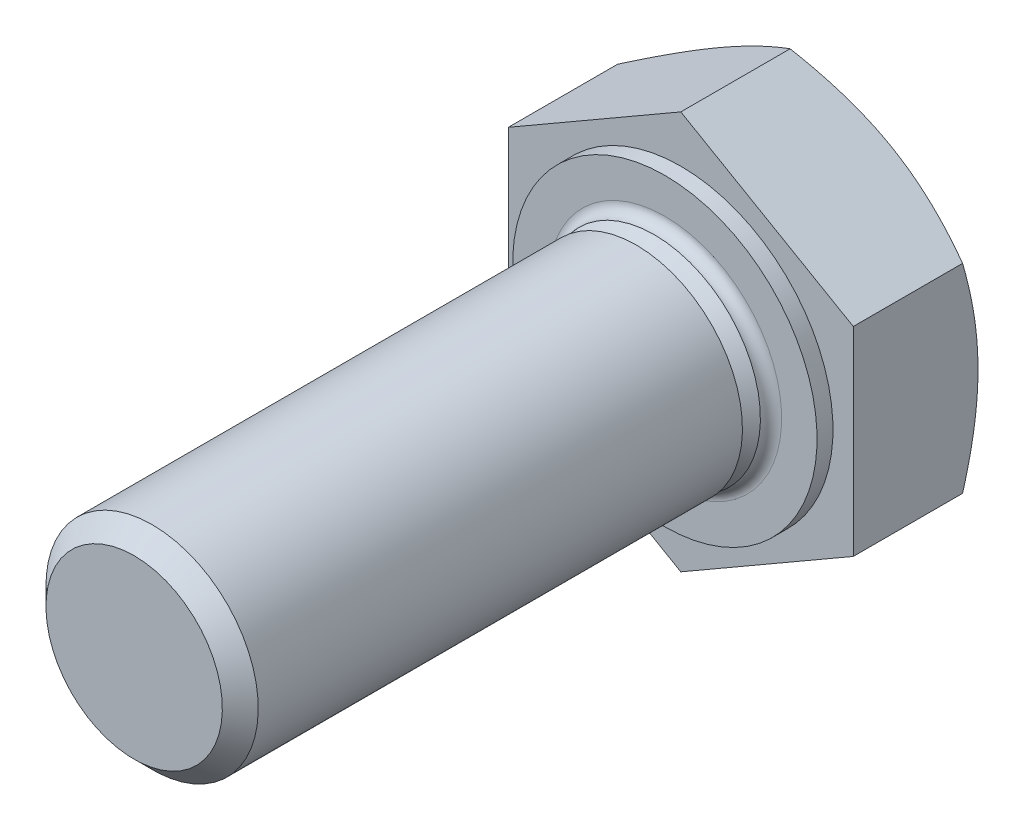
ISO-10303-21;
HEADER;
FILE_DESCRIPTION(('STEP AP214'),'2;1');
FILE_NAME('part.step','',(''),(''),'','','');
FILE_SCHEMA(('AUTOMOTIVE_DESIGN { 1 0 10303 214 1 1 1 1 }'));
ENDSEC;
DATA;
#1=APPLICATION_CONTEXT('core data for automotive mechanical design processes');
#2=APPLICATION_PROTOCOL_DEFINITION('international standard','automotive_design',2000,#1);
#3=PRODUCT_CONTEXT('',#1,'mechanical');
#4=PRODUCT('Part','Part','',(#3));
#5=PRODUCT_RELATED_PRODUCT_CATEGORY('part','',(#4));
#6=PRODUCT_DEFINITION_FORMATION('','',#4);
#7=PRODUCT_DEFINITION_CONTEXT('part definition',#1,'design');
#8=PRODUCT_DEFINITION('design','',#6,#7);
#9=PRODUCT_DEFINITION_SHAPE('','',#8);
#10=(LENGTH_UNIT() NAMED_UNIT(*) SI_UNIT(.MILLI.,.METRE.));
#11=(NAMED_UNIT(*) PLANE_ANGLE_UNIT() SI_UNIT($,.RADIAN.));
#12=(NAMED_UNIT(*) SI_UNIT($,.STERADIAN.) SOLID_ANGLE_UNIT());
#13=UNCERTAINTY_MEASURE_WITH_UNIT(LENGTH_MEASURE(1.E-05),#10,'distance_accuracy_value','');
#14=(GEOMETRIC_REPRESENTATION_CONTEXT(3) GLOBAL_UNCERTAINTY_ASSIGNED_CONTEXT((#13)) GLOBAL_UNIT_ASSIGNED_CONTEXT((#10,
#11,#12)) REPRESENTATION_CONTEXT('',''));
#15=CARTESIAN_POINT('',(0.,0.,0.));
#16=DIRECTION('',(0.,0.,1.));
#17=DIRECTION('',(1.,0.,0.));
#18=AXIS2_PLACEMENT_3D('',#15,#16,#17);
#19=CARTESIAN_POINT('',(0.,1.66171875,20.));
#20=DIRECTION('',(0.,0.,1.));
#21=DIRECTION('',(0.,1.,0.));
#22=AXIS2_PLACEMENT_3D('',#19,#20,#21);
#23=PLANE('',#22);
#24=CARTESIAN_POINT('',(0.,0.,20.));
#25=DIRECTION('',(0.,0.,1.));
#26=DIRECTION('',(0.,1.,0.));
#27=AXIS2_PLACEMENT_3D('',#24,#25,#26);
#28=CIRCLE('',#27,3.3234375);
#29=CARTESIAN_POINT('',(0.,3.3234375,20.));
#30=VERTEX_POINT('',#29);
#31=EDGE_CURVE('E11',#30,#30,#28,.T.);
#32=ORIENTED_EDGE('',*,*,#31,.T.);
#33=EDGE_LOOP('',(#32));
#34=FACE_BOUND('',#33,.T.);
#35=ADVANCED_FACE('F17',(#34),#23,.T.);
#36=CARTESIAN_POINT('',(0.,0.,19.66171875));
#37=DIRECTION('',(0.,0.,-1.));
#38=DIRECTION('',(0.,1.,0.));
#39=AXIS2_PLACEMENT_3D('',#36,#37,#38);
#40=CONICAL_SURFACE('',#39,3.66171875,0.785398163397449);
#41=CARTESIAN_POINT('',(0.,0.,19.3234375));
#42=DIRECTION('',(0.,0.,1.));
#43=DIRECTION('',(0.,1.,0.));
#44=AXIS2_PLACEMENT_3D('',#41,#42,#43);
#45=CIRCLE('',#44,4.);
#46=CARTESIAN_POINT('',(0.,4.,19.3234375));
#47=VERTEX_POINT('',#46);
#48=EDGE_CURVE('E26',#47,#47,#45,.T.);
#49=ORIENTED_EDGE('',*,*,#48,.T.);
#50=EDGE_LOOP('',(#49));
#51=FACE_BOUND('',#50,.T.);
#52=ORIENTED_EDGE('',*,*,#31,.F.);
#53=EDGE_LOOP('',(#52));
#54=FACE_BOUND('',#53,.T.);
#55=ADVANCED_FACE('F310',(#51,#54),#40,.T.);
#56=CARTESIAN_POINT('',(0.,0.,10.2));
#57=DIRECTION('',(0.,0.,-1.));
#58=DIRECTION('',(0.,1.,0.));
#59=AXIS2_PLACEMENT_3D('',#56,#57,#58);
#60=CYLINDRICAL_SURFACE('',#59,4.);
#61=CARTESIAN_POINT('',(0.,0.,1.0765625));
#62=DIRECTION('',(0.,0.,1.));
#63=DIRECTION('',(0.,1.,0.));
#64=AXIS2_PLACEMENT_3D('',#61,#62,#63);
#65=CIRCLE('',#64,4.);
#66=CARTESIAN_POINT('',(0.,4.,1.0765625));
#67=VERTEX_POINT('',#66);
#68=EDGE_CURVE('E49',#67,#67,#65,.T.);
#69=ORIENTED_EDGE('',*,*,#68,.T.);
#70=EDGE_LOOP('',(#69));
#71=FACE_BOUND('',#70,.T.);
#72=ORIENTED_EDGE('',*,*,#48,.F.);
#73=EDGE_LOOP('',(#72));
#74=FACE_BOUND('',#73,.T.);
#75=ADVANCED_FACE('F315',(#71,#74),#60,.T.);
#76=CARTESIAN_POINT('',(0.,3.66171875,1.0765625));
#77=DIRECTION('',(0.,0.,-1.));
#78=DIRECTION('',(0.,-1.,0.));
#79=AXIS2_PLACEMENT_3D('',#76,#77,#78);
#80=PLANE('',#79);
#81=CARTESIAN_POINT('',(0.,0.,1.0765625));
#82=DIRECTION('',(0.,0.,1.));
#83=DIRECTION('',(0.,1.,0.));
#84=AXIS2_PLACEMENT_3D('',#81,#82,#83);
#85=CIRCLE('',#84,3.3234375);
#86=CARTESIAN_POINT('',(0.,3.3234375,1.0765625));
#87=VERTEX_POINT('',#86);
#88=EDGE_CURVE('E55',#87,#87,#85,.T.);
#89=ORIENTED_EDGE('',*,*,#88,.T.);
#90=EDGE_LOOP('',(#89));
#91=FACE_BOUND('',#90,.T.);
#92=ORIENTED_EDGE('',*,*,#68,.F.);
#93=EDGE_LOOP('',(#92));
#94=FACE_BOUND('',#93,.T.);
#95=ADVANCED_FACE('F347',(#91,#94),#80,.T.);
#96=CARTESIAN_POINT('',(0.,0.,0.73828125));
#97=DIRECTION('',(0.,0.,-1.));
#98=DIRECTION('',(0.,1.,0.));
#99=AXIS2_PLACEMENT_3D('',#96,#97,#98);
#100=CONICAL_SURFACE('',#99,3.66171875,0.785398163397448);
#101=CARTESIAN_POINT('',(0.,0.,0.4));
#102=DIRECTION('',(0.,0.,1.));
#103=DIRECTION('',(0.,1.,0.));
#104=AXIS2_PLACEMENT_3D('',#101,#102,#103);
#105=CIRCLE('',#104,4.);
#106=CARTESIAN_POINT('',(0.,4.,0.4));
#107=VERTEX_POINT('',#106);
#108=EDGE_CURVE('E219',#107,#107,#105,.T.);
#109=ORIENTED_EDGE('',*,*,#108,.T.);
#110=EDGE_LOOP('',(#109));
#111=FACE_BOUND('',#110,.T.);
#112=ORIENTED_EDGE('',*,*,#88,.F.);
#113=EDGE_LOOP('',(#112));
#114=FACE_BOUND('',#113,.T.);
#115=ADVANCED_FACE('F341',(#111,#114),#100,.T.);
#116=CARTESIAN_POINT('',(0.,0.,0.4));
#117=DIRECTION('',(0.,0.,1.));
#118=DIRECTION('',(1.,0.,0.));
#119=AXIS2_PLACEMENT_3D('',#116,#117,#118);
#120=TOROIDAL_SURFACE('',#119,4.4,0.4);
#121=CARTESIAN_POINT('',(0.,0.,0.));
#122=DIRECTION('',(0.,0.,1.));
#123=DIRECTION('',(0.,1.,0.));
#124=AXIS2_PLACEMENT_3D('',#121,#122,#123);
#125=CIRCLE('',#124,4.4);
#126=CARTESIAN_POINT('',(0.,4.4,0.));
#127=VERTEX_POINT('',#126);
#128=EDGE_CURVE('E207',#127,#127,#125,.T.);
#129=ORIENTED_EDGE('',*,*,#128,.T.);
#130=EDGE_LOOP('',(#129));
#131=FACE_BOUND('',#130,.T.);
#132=ORIENTED_EDGE('',*,*,#108,.F.);
#133=EDGE_LOOP('',(#132));
#134=FACE_BOUND('',#133,.T.);
#135=ADVANCED_FACE('F338',(#131,#134),#120,.F.);
#136=CARTESIAN_POINT('',(0.,5.0675,0.));
#137=DIRECTION('',(0.,0.,1.));
#138=DIRECTION('',(0.,1.,0.));
#139=AXIS2_PLACEMENT_3D('',#136,#137,#138);
#140=PLANE('',#139);
#141=CARTESIAN_POINT('',(0.,0.,0.));
#142=DIRECTION('',(0.,0.,1.));
#143=DIRECTION('',(0.,1.,0.));
#144=AXIS2_PLACEMENT_3D('',#141,#142,#143);
#145=CIRCLE('',#144,5.735);
#146=CARTESIAN_POINT('',(0.,5.735,0.));
#147=VERTEX_POINT('',#146);
#148=EDGE_CURVE('E111',#147,#147,#145,.T.);
#149=ORIENTED_EDGE('',*,*,#148,.T.);
#150=EDGE_LOOP('',(#149));
#151=FACE_BOUND('',#150,.T.);
#152=ORIENTED_EDGE('',*,*,#128,.F.);
#153=EDGE_LOOP('',(#152));
#154=FACE_BOUND('',#153,.T.);
#155=ADVANCED_FACE('F333',(#151,#154),#140,.T.);
#156=CARTESIAN_POINT('',(0.,0.,-0.55));
#157=DIRECTION('',(0.,0.,-1.));
#158=DIRECTION('',(0.,1.,0.));
#159=AXIS2_PLACEMENT_3D('',#156,#157,#158);
#160=CYLINDRICAL_SURFACE('',#159,5.735);
#161=ORIENTED_EDGE('',*,*,#148,.F.);
#162=EDGE_LOOP('',(#161));
#163=FACE_BOUND('',#162,.T.);
#164=CARTESIAN_POINT('',(0.,0.,-0.6));
#165=DIRECTION('',(0.,0.,1.));
#166=DIRECTION('',(0.,1.,0.));
#167=AXIS2_PLACEMENT_3D('',#164,#165,#166);
#168=CIRCLE('',#167,5.735);
#169=CARTESIAN_POINT('',(0.,-5.735,-0.6));
#170=VERTEX_POINT('',#169);
#171=EDGE_CURVE('E253',#170,#170,#168,.T.);
#172=ORIENTED_EDGE('',*,*,#171,.T.);
#173=EDGE_LOOP('',(#172));
#174=FACE_BOUND('',#173,.T.);
#175=ADVANCED_FACE('F328',(#163,#174),#160,.T.);
#176=CARTESIAN_POINT('',(-3.25,-5.62916512459885,0.4));
#177=DIRECTION('',(-0.5,-0.866025403784439,0.));
#178=DIRECTION('',(-0.866025403784439,0.5,0.));
#179=AXIS2_PLACEMENT_3D('',#176,#177,#178);
#180=PLANE('',#179);
#181=CARTESIAN_POINT('',(0.0033701276522522,-7.50749924357236,-4.71831960379145));
#182=CARTESIAN_POINT('',(-1.74031548600823,-6.50078188514341,-5.3));
#183=CARTESIAN_POINT('',(-3.25,-5.62916512459885,-5.3));
#184=CARTESIAN_POINT('',(-4.75968451399176,-4.75754836405429,-5.3));
#185=CARTESIAN_POINT('',(-6.50337012765225,-3.75083100562533,-4.71831960379145));
#186=(BOUNDED_CURVE() B_SPLINE_CURVE(2,(#181,#182,#183,#184,#185),.UNSPECIFIED.,.F.,
.F.) B_SPLINE_CURVE_WITH_KNOTS((3,2,3),(0.,3.81115565838423,7.62231131676846),
.UNSPECIFIED.) CURVE() GEOMETRIC_REPRESENTATION_ITEM() RATIONAL_B_SPLINE_CURVE((1.,
1.03802697460133,1.,1.03802697460134,1.)) REPRESENTATION_ITEM(''));
#187=CARTESIAN_POINT('',(0.,-7.50555349946513,-4.71944341639924));
#188=VERTEX_POINT('',#187);
#189=CARTESIAN_POINT('',(-3.25,-5.62916512459885,-5.3));
#190=VERTEX_POINT('',#189);
#191=EDGE_CURVE('E115',#188,#190,#186,.T.);
#192=ORIENTED_EDGE('',*,*,#191,.F.);
#193=DIRECTION('',(0.,0.,-1.));
#194=VECTOR('',#193,1.);
#195=CARTESIAN_POINT('',(0.,-7.50555349946513,0.4));
#196=LINE('',#195,#194);
#197=CARTESIAN_POINT('',(0.,-7.50555349946513,-0.6));
#198=VERTEX_POINT('',#197);
#199=EDGE_CURVE('E97',#198,#188,#196,.T.);
#200=ORIENTED_EDGE('',*,*,#199,.F.);
#201=DIRECTION('',(0.866025403784439,-0.5,0.));
#202=VECTOR('',#201,1.);
#203=CARTESIAN_POINT('',(-2.43728928513604,-6.09838387459885,-0.6));
#204=LINE('',#203,#202);
#205=CARTESIAN_POINT('',(-6.5,-3.75277674973257,-0.6));
#206=VERTEX_POINT('',#205);
#207=EDGE_CURVE('E256',#206,#198,#204,.T.);
#208=ORIENTED_EDGE('',*,*,#207,.F.);
#209=DIRECTION('',(0.,0.,-1.));
#210=VECTOR('',#209,1.);
#211=CARTESIAN_POINT('',(-6.5,-3.75277674973257,0.4));
#212=LINE('',#211,#210);
#213=CARTESIAN_POINT('',(-6.5,-3.75277674973256,-4.71944341639924));
#214=VERTEX_POINT('',#213);
#215=EDGE_CURVE('E231',#206,#214,#212,.T.);
#216=ORIENTED_EDGE('',*,*,#215,.T.);
#217=CARTESIAN_POINT('',(0.0033701276522522,-7.50749924357236,-4.71831960379145));
#218=CARTESIAN_POINT('',(-1.74031548600823,-6.50078188514341,-5.3));
#219=CARTESIAN_POINT('',(-3.25,-5.62916512459885,-5.3));
#220=CARTESIAN_POINT('',(-4.75968451399176,-4.75754836405429,-5.3));
#221=CARTESIAN_POINT('',(-6.50337012765225,-3.75083100562533,-4.71831960379145));
#222=(BOUNDED_CURVE() B_SPLINE_CURVE(2,(#217,#218,#219,#220,#221),.UNSPECIFIED.,.F.,
.F.) B_SPLINE_CURVE_WITH_KNOTS((3,2,3),(0.,3.81115565838423,7.62231131676846),
.UNSPECIFIED.) CURVE() GEOMETRIC_REPRESENTATION_ITEM() RATIONAL_B_SPLINE_CURVE((1.,
1.03802697460133,1.,1.03802697460134,1.)) REPRESENTATION_ITEM(''));
#223=EDGE_CURVE('E118',#190,#214,#222,.T.);
#224=ORIENTED_EDGE('',*,*,#223,.F.);
#225=EDGE_LOOP('',(#192,#200,#208,#216,#224));
#226=FACE_BOUND('',#225,.T.);
#227=ADVANCED_FACE('F116',(#226),#180,.T.);
#228=CARTESIAN_POINT('',(6.5,0.,0.4));
#229=DIRECTION('',(1.,0.,0.));
#230=DIRECTION('',(0.,-1.,0.));
#231=AXIS2_PLACEMENT_3D('',#228,#229,#230);
#232=PLANE('',#231);
#233=CARTESIAN_POINT('',(6.5,3.75666823794703,-4.71831960379145));
#234=CARTESIAN_POINT('',(6.5,1.74323352108911,-5.3));
#235=CARTESIAN_POINT('',(6.5,0.,-5.3));
#236=CARTESIAN_POINT('',(6.5,-1.74323352108911,-5.3));
#237=CARTESIAN_POINT('',(6.5,-3.75666823794702,-4.71831960379145));
#238=(BOUNDED_CURVE() B_SPLINE_CURVE(2,(#233,#234,#235,#236,#237),.UNSPECIFIED.,.F.,
.F.) B_SPLINE_CURVE_WITH_KNOTS((3,2,3),(0.,3.81115565838423,7.62231131676846),
.UNSPECIFIED.) CURVE() GEOMETRIC_REPRESENTATION_ITEM() RATIONAL_B_SPLINE_CURVE((1.,
1.03802697460134,1.,1.03802697460135,1.)) REPRESENTATION_ITEM(''));
#239=CARTESIAN_POINT('',(6.5,3.75277674973257,-4.71944341639923));
#240=VERTEX_POINT('',#239);
#241=CARTESIAN_POINT('',(6.5,0.,-5.3));
#242=VERTEX_POINT('',#241);
#243=EDGE_CURVE('E197',#240,#242,#238,.T.);
#244=ORIENTED_EDGE('',*,*,#243,.F.);
#245=DIRECTION('',(0.,0.,-1.));
#246=VECTOR('',#245,1.);
#247=CARTESIAN_POINT('',(6.5,3.75277674973257,0.4));
#248=LINE('',#247,#246);
#249=CARTESIAN_POINT('',(6.5,3.75277674973257,-0.6));
#250=VERTEX_POINT('',#249);
#251=EDGE_CURVE('E229',#250,#240,#248,.T.);
#252=ORIENTED_EDGE('',*,*,#251,.F.);
#253=DIRECTION('',(0.,1.,0.));
#254=VECTOR('',#253,1.);
#255=CARTESIAN_POINT('',(6.5,-1.876875,-0.6));
#256=LINE('',#255,#254);
#257=CARTESIAN_POINT('',(6.5,-3.75277674973256,-0.6));
#258=VERTEX_POINT('',#257);
#259=EDGE_CURVE('E167',#258,#250,#256,.T.);
#260=ORIENTED_EDGE('',*,*,#259,.F.);
#261=DIRECTION('',(0.,0.,-1.));
#262=VECTOR('',#261,1.);
#263=CARTESIAN_POINT('',(6.5,-3.75277674973256,0.4));
#264=LINE('',#263,#262);
#265=CARTESIAN_POINT('',(6.5,-3.75277674973256,-4.71944341639923));
#266=VERTEX_POINT('',#265);
#267=EDGE_CURVE('E112',#258,#266,#264,.T.);
#268=ORIENTED_EDGE('',*,*,#267,.T.);
#269=CARTESIAN_POINT('',(6.5,3.75666823794703,-4.71831960379145));
#270=CARTESIAN_POINT('',(6.5,1.74323352108911,-5.3));
#271=CARTESIAN_POINT('',(6.5,0.,-5.3));
#272=CARTESIAN_POINT('',(6.5,-1.74323352108911,-5.3));
#273=CARTESIAN_POINT('',(6.5,-3.75666823794702,-4.71831960379145));
#274=(BOUNDED_CURVE() B_SPLINE_CURVE(2,(#269,#270,#271,#272,#273),.UNSPECIFIED.,.F.,
.F.) B_SPLINE_CURVE_WITH_KNOTS((3,2,3),(0.,3.81115565838423,7.62231131676846),
.UNSPECIFIED.) CURVE() GEOMETRIC_REPRESENTATION_ITEM() RATIONAL_B_SPLINE_CURVE((1.,
1.03802697460134,1.,1.03802697460135,1.)) REPRESENTATION_ITEM(''));
#275=EDGE_CURVE('E166',#242,#266,#274,.T.);
#276=ORIENTED_EDGE('',*,*,#275,.F.);
#277=EDGE_LOOP('',(#244,#252,#260,#268,#276));
#278=FACE_BOUND('',#277,.T.);
#279=ADVANCED_FACE('F285',(#278),#232,.T.);
#280=CARTESIAN_POINT('',(3.25,-5.62916512459885,0.4));
#281=DIRECTION('',(0.5,-0.866025403784439,0.));
#282=DIRECTION('',(-0.866025403784439,-0.5,0.));
#283=AXIS2_PLACEMENT_3D('',#280,#281,#282);
#284=PLANE('',#283);
#285=CARTESIAN_POINT('',(6.50337012765225,-3.75083100562534,-4.71831960379145));
#286=CARTESIAN_POINT('',(4.75968451399176,-4.7575483640543,-5.3));
#287=CARTESIAN_POINT('',(3.25,-5.62916512459885,-5.3));
#288=CARTESIAN_POINT('',(1.74031548600824,-6.5007818851434,-5.3));
#289=CARTESIAN_POINT('',(-0.00337012765224415,-7.50749924357236,-4.71831960379145));
#290=(BOUNDED_CURVE() B_SPLINE_CURVE(2,(#285,#286,#287,#288,#289),.UNSPECIFIED.,.F.,
.F.) B_SPLINE_CURVE_WITH_KNOTS((3,2,3),(0.,3.81115565838422,7.62231131676845),
.UNSPECIFIED.) CURVE() GEOMETRIC_REPRESENTATION_ITEM() RATIONAL_B_SPLINE_CURVE((1.,
1.03802697460134,1.,1.03802697460134,1.)) REPRESENTATION_ITEM(''));
#291=CARTESIAN_POINT('',(3.25,-5.62916512459885,-5.3));
#292=VERTEX_POINT('',#291);
#293=EDGE_CURVE('E126',#266,#292,#290,.T.);
#294=ORIENTED_EDGE('',*,*,#293,.F.);
#295=ORIENTED_EDGE('',*,*,#267,.F.);
#296=DIRECTION('',(0.866025403784439,0.5,0.));
#297=VECTOR('',#296,1.);
#298=CARTESIAN_POINT('',(2.43728928513604,-6.09838387459885,-0.6));
#299=LINE('',#298,#297);
#300=EDGE_CURVE('E107',#198,#258,#299,.T.);
#301=ORIENTED_EDGE('',*,*,#300,.F.);
#302=ORIENTED_EDGE('',*,*,#199,.T.);
#303=CARTESIAN_POINT('',(6.50337012765225,-3.75083100562534,-4.71831960379145));
#304=CARTESIAN_POINT('',(4.75968451399176,-4.7575483640543,-5.3));
#305=CARTESIAN_POINT('',(3.25,-5.62916512459885,-5.3));
#306=CARTESIAN_POINT('',(1.74031548600824,-6.5007818851434,-5.3));
#307=CARTESIAN_POINT('',(-0.00337012765224415,-7.50749924357236,-4.71831960379145));
#308=(BOUNDED_CURVE() B_SPLINE_CURVE(2,(#303,#304,#305,#306,#307),.UNSPECIFIED.,.F.,
.F.) B_SPLINE_CURVE_WITH_KNOTS((3,2,3),(0.,3.81115565838422,7.62231131676845),
.UNSPECIFIED.) CURVE() GEOMETRIC_REPRESENTATION_ITEM() RATIONAL_B_SPLINE_CURVE((1.,
1.03802697460134,1.,1.03802697460134,1.)) REPRESENTATION_ITEM(''));
#309=EDGE_CURVE('E102',#292,#188,#308,.T.);
#310=ORIENTED_EDGE('',*,*,#309,.F.);
#311=EDGE_LOOP('',(#294,#295,#301,#302,#310));
#312=FACE_BOUND('',#311,.T.);
#313=ADVANCED_FACE('F100',(#312),#284,.T.);
#314=CARTESIAN_POINT('',(-6.5,0.,0.4));
#315=DIRECTION('',(-1.,0.,0.));
#316=DIRECTION('',(0.,1.,0.));
#317=AXIS2_PLACEMENT_3D('',#314,#315,#316);
#318=PLANE('',#317);
#319=CARTESIAN_POINT('',(-6.5,-3.75666823794702,-4.71831960379145));
#320=CARTESIAN_POINT('',(-6.5,-1.74323352108911,-5.3));
#321=CARTESIAN_POINT('',(-6.5,0.,-5.3));
#322=CARTESIAN_POINT('',(-6.5,1.74323352108911,-5.3));
#323=CARTESIAN_POINT('',(-6.5,3.75666823794702,-4.71831960379145));
#324=(BOUNDED_CURVE() B_SPLINE_CURVE(2,(#319,#320,#321,#322,#323),.UNSPECIFIED.,.F.,
.F.) B_SPLINE_CURVE_WITH_KNOTS((3,2,3),(0.,3.81115565838423,7.62231131676846),
.UNSPECIFIED.) CURVE() GEOMETRIC_REPRESENTATION_ITEM() RATIONAL_B_SPLINE_CURVE((1.,
1.03802697460133,1.,1.03802697460133,1.)) REPRESENTATION_ITEM(''));
#325=CARTESIAN_POINT('',(-6.5,0.,-5.3));
#326=VERTEX_POINT('',#325);
#327=CARTESIAN_POINT('',(-6.5,3.75277674973256,-4.71944341639924));
#328=VERTEX_POINT('',#327);
#329=EDGE_CURVE('E150',#326,#328,#324,.T.);
#330=ORIENTED_EDGE('',*,*,#329,.F.);
#331=CARTESIAN_POINT('',(-6.5,-3.75666823794702,-4.71831960379145));
#332=CARTESIAN_POINT('',(-6.5,-1.74323352108911,-5.3));
#333=CARTESIAN_POINT('',(-6.5,0.,-5.3));
#334=CARTESIAN_POINT('',(-6.5,1.74323352108911,-5.3));
#335=CARTESIAN_POINT('',(-6.5,3.75666823794702,-4.71831960379145));
#336=(BOUNDED_CURVE() B_SPLINE_CURVE(2,(#331,#332,#333,#334,#335),.UNSPECIFIED.,.F.,
.F.) B_SPLINE_CURVE_WITH_KNOTS((3,2,3),(0.,3.81115565838423,7.62231131676846),
.UNSPECIFIED.) CURVE() GEOMETRIC_REPRESENTATION_ITEM() RATIONAL_B_SPLINE_CURVE((1.,
1.03802697460133,1.,1.03802697460133,1.)) REPRESENTATION_ITEM(''));
#337=EDGE_CURVE('E178',#214,#326,#336,.T.);
#338=ORIENTED_EDGE('',*,*,#337,.F.);
#339=ORIENTED_EDGE('',*,*,#215,.F.);
#340=DIRECTION('',(0.,-1.,0.));
#341=VECTOR('',#340,1.);
#342=CARTESIAN_POINT('',(-6.5,-1.876875,-0.6));
#343=LINE('',#342,#341);
#344=CARTESIAN_POINT('',(-6.5,3.75277674973256,-0.6));
#345=VERTEX_POINT('',#344);
#346=EDGE_CURVE('E226',#345,#206,#343,.T.);
#347=ORIENTED_EDGE('',*,*,#346,.F.);
#348=DIRECTION('',(0.,0.,-1.));
#349=VECTOR('',#348,1.);
#350=CARTESIAN_POINT('',(-6.5,3.75277674973256,0.4));
#351=LINE('',#350,#349);
#352=EDGE_CURVE('E177',#345,#328,#351,.T.);
#353=ORIENTED_EDGE('',*,*,#352,.T.);
#354=EDGE_LOOP('',(#330,#338,#339,#347,#353));
#355=FACE_BOUND('',#354,.T.);
#356=ADVANCED_FACE('F273',(#355),#318,.T.);
#357=CARTESIAN_POINT('',(3.25,5.62916512459885,0.4));
#358=DIRECTION('',(0.5,0.866025403784439,0.));
#359=DIRECTION('',(0.866025403784439,-0.5,0.));
#360=AXIS2_PLACEMENT_3D('',#357,#358,#359);
#361=PLANE('',#360);
#362=CARTESIAN_POINT('',(-0.00337012765224939,7.50749924357236,-4.71831960379145));
#363=CARTESIAN_POINT('',(1.74031548600824,6.50078188514341,-5.3));
#364=CARTESIAN_POINT('',(3.25,5.62916512459885,-5.3));
#365=CARTESIAN_POINT('',(4.75968451399176,4.75754836405431,-5.30000000000001));
#366=CARTESIAN_POINT('',(6.50337012765225,3.75083100562534,-4.71831960379145));
#367=(BOUNDED_CURVE() B_SPLINE_CURVE(2,(#362,#363,#364,#365,#366),.UNSPECIFIED.,.F.,
.F.) B_SPLINE_CURVE_WITH_KNOTS((3,2,3),(0.,3.81115565838423,7.62231131676845),
.UNSPECIFIED.) CURVE() GEOMETRIC_REPRESENTATION_ITEM() RATIONAL_B_SPLINE_CURVE((1.,
1.03802697460132,1.,1.03802697460133,1.)) REPRESENTATION_ITEM(''));
#368=CARTESIAN_POINT('',(3.25,5.62916512459885,-5.3));
#369=VERTEX_POINT('',#368);
#370=EDGE_CURVE('E182',#369,#240,#367,.T.);
#371=ORIENTED_EDGE('',*,*,#370,.F.);
#372=CARTESIAN_POINT('',(-0.00337012765224939,7.50749924357236,-4.71831960379145));
#373=CARTESIAN_POINT('',(1.74031548600824,6.50078188514341,-5.3));
#374=CARTESIAN_POINT('',(3.25,5.62916512459885,-5.3));
#375=CARTESIAN_POINT('',(4.75968451399176,4.75754836405431,-5.30000000000001));
#376=CARTESIAN_POINT('',(6.50337012765225,3.75083100562534,-4.71831960379145));
#377=(BOUNDED_CURVE() B_SPLINE_CURVE(2,(#372,#373,#374,#375,#376),.UNSPECIFIED.,.F.,
.F.) B_SPLINE_CURVE_WITH_KNOTS((3,2,3),(0.,3.81115565838423,7.62231131676845),
.UNSPECIFIED.) CURVE() GEOMETRIC_REPRESENTATION_ITEM() RATIONAL_B_SPLINE_CURVE((1.,
1.03802697460132,1.,1.03802697460133,1.)) REPRESENTATION_ITEM(''));
#378=CARTESIAN_POINT('',(0.,7.50555349946513,-4.71944341639923));
#379=VERTEX_POINT('',#378);
#380=EDGE_CURVE('E141',#379,#369,#377,.T.);
#381=ORIENTED_EDGE('',*,*,#380,.F.);
#382=DIRECTION('',(0.,0.,-1.));
#383=VECTOR('',#382,1.);
#384=CARTESIAN_POINT('',(0.,7.50555349946513,0.4));
#385=LINE('',#384,#383);
#386=CARTESIAN_POINT('',(0.,7.50555349946513,-0.6));
#387=VERTEX_POINT('',#386);
#388=EDGE_CURVE('E227',#387,#379,#385,.T.);
#389=ORIENTED_EDGE('',*,*,#388,.F.);
#390=DIRECTION('',(-0.866025403784439,0.5,0.));
#391=VECTOR('',#390,1.);
#392=CARTESIAN_POINT('',(4.06271071486396,5.15994637459885,-0.6));
#393=LINE('',#392,#391);
#394=EDGE_CURVE('E173',#250,#387,#393,.T.);
#395=ORIENTED_EDGE('',*,*,#394,.F.);
#396=ORIENTED_EDGE('',*,*,#251,.T.);
#397=EDGE_LOOP('',(#371,#381,#389,#395,#396));
#398=FACE_BOUND('',#397,.T.);
#399=ADVANCED_FACE('F288',(#398),#361,.T.);
#400=CARTESIAN_POINT('',(-3.25,5.62916512459885,0.4));
#401=DIRECTION('',(-0.5,0.866025403784439,0.));
#402=DIRECTION('',(0.866025403784439,0.5,0.));
#403=AXIS2_PLACEMENT_3D('',#400,#401,#402);
#404=PLANE('',#403);
#405=CARTESIAN_POINT('',(-6.50337012765225,3.75083100562533,-4.71831960379145));
#406=CARTESIAN_POINT('',(-4.75968451399177,4.7575483640543,-5.30000000000001));
#407=CARTESIAN_POINT('',(-3.25,5.62916512459885,-5.3));
#408=CARTESIAN_POINT('',(-1.74031548600823,6.5007818851434,-5.29999999999999));
#409=CARTESIAN_POINT('',(0.00337012765224554,7.50749924357236,-4.71831960379145));
#410=(BOUNDED_CURVE() B_SPLINE_CURVE(2,(#405,#406,#407,#408,#409),.UNSPECIFIED.,.F.,
.F.) B_SPLINE_CURVE_WITH_KNOTS((3,2,3),(0.,3.81115565838423,7.62231131676846),
.UNSPECIFIED.) CURVE() GEOMETRIC_REPRESENTATION_ITEM() RATIONAL_B_SPLINE_CURVE((1.,
1.03802697460133,1.,1.03802697460132,1.)) REPRESENTATION_ITEM(''));
#411=CARTESIAN_POINT('',(-3.25,5.62916512459885,-5.3));
#412=VERTEX_POINT('',#411);
#413=EDGE_CURVE('E222',#412,#379,#410,.T.);
#414=ORIENTED_EDGE('',*,*,#413,.F.);
#415=CARTESIAN_POINT('',(-6.50337012765225,3.75083100562533,-4.71831960379145));
#416=CARTESIAN_POINT('',(-4.75968451399177,4.7575483640543,-5.30000000000001));
#417=CARTESIAN_POINT('',(-3.25,5.62916512459885,-5.3));
#418=CARTESIAN_POINT('',(-1.74031548600823,6.5007818851434,-5.29999999999999));
#419=CARTESIAN_POINT('',(0.00337012765224554,7.50749924357236,-4.71831960379145));
#420=(BOUNDED_CURVE() B_SPLINE_CURVE(2,(#415,#416,#417,#418,#419),.UNSPECIFIED.,.F.,
.F.) B_SPLINE_CURVE_WITH_KNOTS((3,2,3),(0.,3.81115565838423,7.62231131676846),
.UNSPECIFIED.) CURVE() GEOMETRIC_REPRESENTATION_ITEM() RATIONAL_B_SPLINE_CURVE((1.,
1.03802697460133,1.,1.03802697460132,1.)) REPRESENTATION_ITEM(''));
#421=EDGE_CURVE('E131',#328,#412,#420,.T.);
#422=ORIENTED_EDGE('',*,*,#421,.F.);
#423=ORIENTED_EDGE('',*,*,#352,.F.);
#424=DIRECTION('',(-0.866025403784439,-0.5,0.));
#425=VECTOR('',#424,1.);
#426=CARTESIAN_POINT('',(-4.06271071486396,5.15994637459885,-0.6));
#427=LINE('',#426,#425);
#428=EDGE_CURVE('E223',#387,#345,#427,.T.);
#429=ORIENTED_EDGE('',*,*,#428,.F.);
#430=ORIENTED_EDGE('',*,*,#388,.T.);
#431=EDGE_LOOP('',(#414,#422,#423,#429,#430));
#432=FACE_BOUND('',#431,.T.);
#433=ADVANCED_FACE('F291',(#432),#404,.T.);
#434=CARTESIAN_POINT('',(0.,-3.25,-5.3));
#435=DIRECTION('',(0.,0.,-1.));
#436=DIRECTION('',(0.,-1.,0.));
#437=AXIS2_PLACEMENT_3D('',#434,#435,#436);
#438=PLANE('',#437);
#439=CARTESIAN_POINT('',(0.,0.,-5.3));
#440=DIRECTION('',(0.,0.,-1.));
#441=DIRECTION('',(0.,-1.,0.));
#442=AXIS2_PLACEMENT_3D('',#439,#440,#441);
#443=CIRCLE('',#442,6.5);
#444=EDGE_CURVE('E121',#292,#190,#443,.T.);
#445=ORIENTED_EDGE('',*,*,#444,.T.);
#446=CARTESIAN_POINT('',(0.,0.,-5.3));
#447=DIRECTION('',(0.,0.,-1.));
#448=DIRECTION('',(0.,-1.,0.));
#449=AXIS2_PLACEMENT_3D('',#446,#447,#448);
#450=CIRCLE('',#449,6.5);
#451=EDGE_CURVE('E174',#190,#326,#450,.T.);
#452=ORIENTED_EDGE('',*,*,#451,.T.);
#453=CARTESIAN_POINT('',(0.,0.,-5.3));
#454=DIRECTION('',(0.,0.,-1.));
#455=DIRECTION('',(0.,-1.,0.));
#456=AXIS2_PLACEMENT_3D('',#453,#454,#455);
#457=CIRCLE('',#456,6.5);
#458=EDGE_CURVE('E158',#326,#412,#457,.T.);
#459=ORIENTED_EDGE('',*,*,#458,.T.);
#460=CARTESIAN_POINT('',(0.,0.,-5.3));
#461=DIRECTION('',(0.,0.,-1.));
#462=DIRECTION('',(0.,-1.,0.));
#463=AXIS2_PLACEMENT_3D('',#460,#461,#462);
#464=CIRCLE('',#463,6.5);
#465=EDGE_CURVE('E149',#412,#369,#464,.T.);
#466=ORIENTED_EDGE('',*,*,#465,.T.);
#467=CARTESIAN_POINT('',(0.,0.,-5.3));
#468=DIRECTION('',(0.,0.,-1.));
#469=DIRECTION('',(0.,-1.,0.));
#470=AXIS2_PLACEMENT_3D('',#467,#468,#469);
#471=CIRCLE('',#470,6.5);
#472=EDGE_CURVE('E190',#369,#242,#471,.T.);
#473=ORIENTED_EDGE('',*,*,#472,.T.);
#474=CARTESIAN_POINT('',(0.,0.,-5.3));
#475=DIRECTION('',(0.,0.,-1.));
#476=DIRECTION('',(0.,-1.,0.));
#477=AXIS2_PLACEMENT_3D('',#474,#475,#476);
#478=CIRCLE('',#477,6.5);
#479=EDGE_CURVE('E124',#242,#292,#478,.T.);
#480=ORIENTED_EDGE('',*,*,#479,.T.);
#481=EDGE_LOOP('',(#445,#452,#459,#466,#473,#480));
#482=FACE_BOUND('',#481,.T.);
#483=ADVANCED_FACE('F279',(#482),#438,.T.);
#484=CARTESIAN_POINT('',(0.,0.,-5.00915980189573));
#485=DIRECTION('',(0.,0.,1.));
#486=DIRECTION('',(0.,-1.,0.));
#487=AXIS2_PLACEMENT_3D('',#484,#485,#486);
#488=CONICAL_SURFACE('',#487,7.00375,1.0471975511966);
#489=ORIENTED_EDGE('',*,*,#223,.T.);
#490=ORIENTED_EDGE('',*,*,#337,.T.);
#491=ORIENTED_EDGE('',*,*,#451,.F.);
#492=EDGE_LOOP('',(#489,#490,#491));
#493=FACE_BOUND('',#492,.T.);
#494=ADVANCED_FACE('F277',(#493),#488,.T.);
#495=CARTESIAN_POINT('',(0.,0.,-5.00915980189573));
#496=DIRECTION('',(0.,0.,1.));
#497=DIRECTION('',(0.,-1.,0.));
#498=AXIS2_PLACEMENT_3D('',#495,#496,#497);
#499=CONICAL_SURFACE('',#498,7.00375,1.0471975511966);
#500=ORIENTED_EDGE('',*,*,#309,.T.);
#501=ORIENTED_EDGE('',*,*,#191,.T.);
#502=ORIENTED_EDGE('',*,*,#444,.F.);
#503=EDGE_LOOP('',(#500,#501,#502));
#504=FACE_BOUND('',#503,.T.);
#505=ADVANCED_FACE('F123',(#504),#499,.T.);
#506=CARTESIAN_POINT('',(0.,0.,-5.00915980189573));
#507=DIRECTION('',(0.,0.,1.));
#508=DIRECTION('',(0.,-1.,0.));
#509=AXIS2_PLACEMENT_3D('',#506,#507,#508);
#510=CONICAL_SURFACE('',#509,7.00375,1.0471975511966);
#511=ORIENTED_EDGE('',*,*,#275,.T.);
#512=ORIENTED_EDGE('',*,*,#293,.T.);
#513=ORIENTED_EDGE('',*,*,#479,.F.);
#514=EDGE_LOOP('',(#511,#512,#513));
#515=FACE_BOUND('',#514,.T.);
#516=ADVANCED_FACE('F281',(#515),#510,.T.);
#517=CARTESIAN_POINT('',(0.,0.,-5.00915980189573));
#518=DIRECTION('',(0.,0.,1.));
#519=DIRECTION('',(0.,-1.,0.));
#520=AXIS2_PLACEMENT_3D('',#517,#518,#519);
#521=CONICAL_SURFACE('',#520,7.00375,1.0471975511966);
#522=ORIENTED_EDGE('',*,*,#243,.T.);
#523=ORIENTED_EDGE('',*,*,#472,.F.);
#524=ORIENTED_EDGE('',*,*,#370,.T.);
#525=EDGE_LOOP('',(#522,#523,#524));
#526=FACE_BOUND('',#525,.T.);
#527=ADVANCED_FACE('F305',(#526),#521,.T.);
#528=CARTESIAN_POINT('',(0.,0.,-5.00915980189573));
#529=DIRECTION('',(0.,0.,1.));
#530=DIRECTION('',(0.,-1.,0.));
#531=AXIS2_PLACEMENT_3D('',#528,#529,#530);
#532=CONICAL_SURFACE('',#531,7.00375,1.0471975511966);
#533=ORIENTED_EDGE('',*,*,#380,.T.);
#534=ORIENTED_EDGE('',*,*,#465,.F.);
#535=ORIENTED_EDGE('',*,*,#413,.T.);
#536=EDGE_LOOP('',(#533,#534,#535));
#537=FACE_BOUND('',#536,.T.);
#538=ADVANCED_FACE('F297',(#537),#532,.T.);
#539=CARTESIAN_POINT('',(0.,0.,-5.00915980189573));
#540=DIRECTION('',(0.,0.,1.));
#541=DIRECTION('',(0.,-1.,0.));
#542=AXIS2_PLACEMENT_3D('',#539,#540,#541);
#543=CONICAL_SURFACE('',#542,7.00375,1.0471975511966);
#544=ORIENTED_EDGE('',*,*,#421,.T.);
#545=ORIENTED_EDGE('',*,*,#458,.F.);
#546=ORIENTED_EDGE('',*,*,#329,.T.);
#547=EDGE_LOOP('',(#544,#545,#546));
#548=FACE_BOUND('',#547,.T.);
#549=ADVANCED_FACE('F295',(#548),#543,.T.);
#550=CARTESIAN_POINT('',(0.,-3.75375,-0.6));
#551=DIRECTION('',(0.,0.,1.));
#552=DIRECTION('',(0.,1.,0.));
#553=AXIS2_PLACEMENT_3D('',#550,#551,#552);
#554=PLANE('',#553);
#555=ORIENTED_EDGE('',*,*,#171,.F.);
#556=EDGE_LOOP('',(#555));
#557=FACE_BOUND('',#556,.T.);
#558=ORIENTED_EDGE('',*,*,#300,.T.);
#559=ORIENTED_EDGE('',*,*,#259,.T.);
#560=ORIENTED_EDGE('',*,*,#394,.T.);
#561=ORIENTED_EDGE('',*,*,#428,.T.);
#562=ORIENTED_EDGE('',*,*,#346,.T.);
#563=ORIENTED_EDGE('',*,*,#207,.T.);
#564=EDGE_LOOP('',(#558,#559,#560,#561,#562,#563));
#565=FACE_BOUND('',#564,.T.);
#566=ADVANCED_FACE('F19',(#557,#565),#554,.T.);
#567=CLOSED_SHELL('',(#35,#55,#75,#95,#115,#135,#155,#175,#227,#279,#313,#356,#399,#433,#483,
#494,#505,#516,#527,#538,#549,#566));
#568=MANIFOLD_SOLID_BREP('B1',#567);
#569=ADVANCED_BREP_SHAPE_REPRESENTATION('',(#18,#568),#14);
#570=SHAPE_DEFINITION_REPRESENTATION(#9,#569);
ENDSEC;
END-ISO-10303-21;
